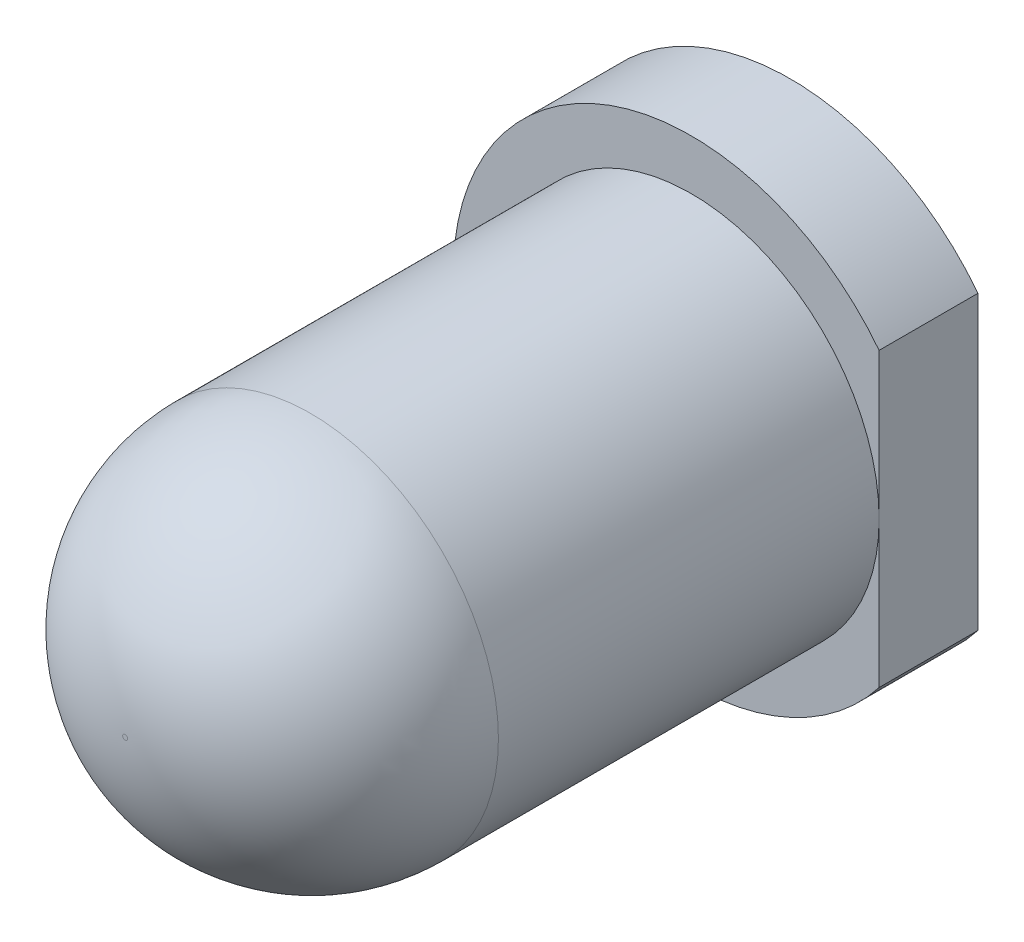
ISO-10303-21;
HEADER;
FILE_DESCRIPTION(('STEP AP214'),'2;1');
FILE_NAME('part.step','',(''),(''),'','','');
FILE_SCHEMA(('AUTOMOTIVE_DESIGN { 1 0 10303 214 1 1 1 1 }'));
ENDSEC;
DATA;
#1=APPLICATION_CONTEXT('core data for automotive mechanical design processes');
#2=APPLICATION_PROTOCOL_DEFINITION('international standard','automotive_design',2000,#1);
#3=PRODUCT_CONTEXT('',#1,'mechanical');
#4=PRODUCT('Part','Part','',(#3));
#5=PRODUCT_RELATED_PRODUCT_CATEGORY('part','',(#4));
#6=PRODUCT_DEFINITION_FORMATION('','',#4);
#7=PRODUCT_DEFINITION_CONTEXT('part definition',#1,'design');
#8=PRODUCT_DEFINITION('design','',#6,#7);
#9=PRODUCT_DEFINITION_SHAPE('','',#8);
#10=(LENGTH_UNIT() NAMED_UNIT(*) SI_UNIT(.MILLI.,.METRE.));
#11=(NAMED_UNIT(*) PLANE_ANGLE_UNIT() SI_UNIT($,.RADIAN.));
#12=(NAMED_UNIT(*) SI_UNIT($,.STERADIAN.) SOLID_ANGLE_UNIT());
#13=UNCERTAINTY_MEASURE_WITH_UNIT(LENGTH_MEASURE(1.E-05),#10,'distance_accuracy_value','');
#14=(GEOMETRIC_REPRESENTATION_CONTEXT(3) GLOBAL_UNCERTAINTY_ASSIGNED_CONTEXT((#13)) GLOBAL_UNIT_ASSIGNED_CONTEXT((#10,
#11,#12)) REPRESENTATION_CONTEXT('',''));
#15=CARTESIAN_POINT('',(0.,0.,0.));
#16=DIRECTION('',(0.,0.,1.));
#17=DIRECTION('',(1.,0.,0.));
#18=AXIS2_PLACEMENT_3D('',#15,#16,#17);
#19=CARTESIAN_POINT('',(0.,0.,5.38));
#20=DIRECTION('',(0.,0.,1.));
#21=DIRECTION('',(1.,0.,0.));
#22=AXIS2_PLACEMENT_3D('',#19,#20,#21);
#23=PLANE('',#22);
#24=CARTESIAN_POINT('',(0.,0.,5.38));
#25=DIRECTION('',(0.,0.,1.));
#26=DIRECTION('',(1.,0.,0.));
#27=AXIS2_PLACEMENT_3D('',#24,#25,#26);
#28=CIRCLE('',#27,0.02);
#29=CARTESIAN_POINT('',(0.02,0.,5.38));
#30=VERTEX_POINT('',#29);
#31=EDGE_CURVE('E11',#30,#30,#28,.T.);
#32=ORIENTED_EDGE('',*,*,#31,.T.);
#33=EDGE_LOOP('',(#32));
#34=FACE_BOUND('',#33,.T.);
#35=ADVANCED_FACE('F16',(#34),#23,.T.);
#36=CARTESIAN_POINT('',(1.52,0.,3.88));
#37=CARTESIAN_POINT('',(1.52,0.,4.115619449019));
#38=CARTESIAN_POINT('',(1.473746610581,0.,4.351242630973));
#39=CARTESIAN_POINT('',(1.381172946414,0.,4.574735226524));
#40=CARTESIAN_POINT('',(1.247268281961,0.,4.774052061599));
#41=CARTESIAN_POINT('',(0.914052061599,0.,5.107268281961));
#42=CARTESIAN_POINT('',(0.714735226524,0.,5.241172946414));
#43=CARTESIAN_POINT('',(0.491242630973,0.,5.333746610581));
#44=CARTESIAN_POINT('',(0.255619449019,0.,5.38));
#45=CARTESIAN_POINT('',(0.02,0.,5.38));
#46=(BOUNDED_CURVE() B_SPLINE_CURVE(5,(#36,#37,#38,#39,#40,#41,#42,#43,#44,#45),.UNSPECIFIED.,
.F.,.F.) B_SPLINE_CURVE_WITH_KNOTS((6,4,6),(0.,0.785398163397,1.570796326795),
.UNSPECIFIED.) CURVE() GEOMETRIC_REPRESENTATION_ITEM() RATIONAL_B_SPLINE_CURVE((1.,1.,1.,1.,1.,
1.,1.,1.,1.,1.)) REPRESENTATION_ITEM(''));
#47=CARTESIAN_POINT('',(0.,0.,3.88));
#48=DIRECTION('',(0.,0.,-1.));
#49=AXIS1_PLACEMENT('',#47,#48);
#50=SURFACE_OF_REVOLUTION('',#46,#49);
#51=CARTESIAN_POINT('',(0.02,0.,3.88));
#52=DIRECTION('',(0.,-1.,0.));
#53=DIRECTION('',(1.,0.,0.));
#54=AXIS2_PLACEMENT_3D('',#51,#52,#53);
#55=CIRCLE('',#54,1.5);
#56=CARTESIAN_POINT('',(1.52,0.,3.88));
#57=VERTEX_POINT('',#56);
#58=EDGE_CURVE('E27',#57,#30,#55,.T.);
#59=ORIENTED_EDGE('',*,*,#58,.F.);
#60=CARTESIAN_POINT('',(0.,0.,3.88));
#61=DIRECTION('',(0.,0.,1.));
#62=DIRECTION('',(1.,0.,0.));
#63=AXIS2_PLACEMENT_3D('',#60,#61,#62);
#64=CIRCLE('',#63,1.52);
#65=EDGE_CURVE('E265',#57,#57,#64,.T.);
#66=ORIENTED_EDGE('',*,*,#65,.T.);
#67=ORIENTED_EDGE('',*,*,#58,.T.);
#68=ORIENTED_EDGE('',*,*,#31,.F.);
#69=EDGE_LOOP('',(#59,#66,#67,#68));
#70=FACE_BOUND('',#69,.T.);
#71=ADVANCED_FACE('F526',(#70),#50,.F.);
#72=CARTESIAN_POINT('',(0.04710743554143,0.,0.));
#73=DIRECTION('',(0.,0.,-1.));
#74=DIRECTION('',(0.,-1.,0.));
#75=AXIS2_PLACEMENT_3D('',#72,#73,#74);
#76=PLANE('',#75);
#77=DIRECTION('',(1.,0.,0.));
#78=VECTOR('',#77,1.);
#79=CARTESIAN_POINT('',(-1.52,-0.25,0.));
#80=LINE('',#79,#78);
#81=CARTESIAN_POINT('',(-1.52,-0.25,0.));
#82=VERTEX_POINT('',#81);
#83=CARTESIAN_POINT('',(-1.02,-0.25,0.));
#84=VERTEX_POINT('',#83);
#85=EDGE_CURVE('E150',#82,#84,#80,.T.);
#86=ORIENTED_EDGE('',*,*,#85,.F.);
#87=DIRECTION('',(0.,-1.,0.));
#88=VECTOR('',#87,1.);
#89=CARTESIAN_POINT('',(-1.52,0.25,0.));
#90=LINE('',#89,#88);
#91=CARTESIAN_POINT('',(-1.52,0.25,0.));
#92=VERTEX_POINT('',#91);
#93=EDGE_CURVE('E20',#92,#82,#90,.T.);
#94=ORIENTED_EDGE('',*,*,#93,.F.);
#95=DIRECTION('',(-1.,0.,0.));
#96=VECTOR('',#95,1.);
#97=CARTESIAN_POINT('',(-1.02,0.25,0.));
#98=LINE('',#97,#96);
#99=CARTESIAN_POINT('',(-1.02,0.25,0.));
#100=VERTEX_POINT('',#99);
#101=EDGE_CURVE('E209',#100,#92,#98,.T.);
#102=ORIENTED_EDGE('',*,*,#101,.F.);
#103=DIRECTION('',(0.,1.,0.));
#104=VECTOR('',#103,1.);
#105=CARTESIAN_POINT('',(-1.02,-0.25,0.));
#106=LINE('',#105,#104);
#107=EDGE_CURVE('E215',#84,#100,#106,.T.);
#108=ORIENTED_EDGE('',*,*,#107,.F.);
#109=EDGE_LOOP('',(#86,#94,#102,#108));
#110=FACE_BOUND('',#109,.T.);
#111=ADVANCED_FACE('F463',(#110),#76,.T.);
#112=CARTESIAN_POINT('',(0.,0.,0.8));
#113=DIRECTION('',(0.,0.,-1.));
#114=DIRECTION('',(1.,0.,0.));
#115=AXIS2_PLACEMENT_3D('',#112,#113,#114);
#116=CYLINDRICAL_SURFACE('',#115,1.52);
#117=CARTESIAN_POINT('',(0.,0.,0.8));
#118=DIRECTION('',(0.,0.,1.));
#119=DIRECTION('',(1.,0.,0.));
#120=AXIS2_PLACEMENT_3D('',#117,#118,#119);
#121=CIRCLE('',#120,1.52);
#122=CARTESIAN_POINT('',(1.52,0.,0.8));
#123=VERTEX_POINT('',#122);
#124=EDGE_CURVE('E206',#123,#123,#121,.T.);
#125=ORIENTED_EDGE('',*,*,#124,.T.);
#126=DIRECTION('',(0.,0.,1.));
#127=VECTOR('',#126,1.);
#128=CARTESIAN_POINT('',(1.52,0.,0.8));
#129=LINE('',#128,#127);
#130=EDGE_CURVE('E55',#123,#57,#129,.T.);
#131=ORIENTED_EDGE('',*,*,#130,.T.);
#132=ORIENTED_EDGE('',*,*,#65,.F.);
#133=ORIENTED_EDGE('',*,*,#130,.F.);
#134=EDGE_LOOP('',(#125,#131,#132,#133));
#135=FACE_BOUND('',#134,.T.);
#136=ADVANCED_FACE('F524',(#135),#116,.T.);
#137=CARTESIAN_POINT('',(-1.52,-0.25,0.));
#138=DIRECTION('',(0.,1.,0.));
#139=DIRECTION('',(1.,0.,0.));
#140=AXIS2_PLACEMENT_3D('',#137,#138,#139);
#141=PLANE('',#140);
#142=ORIENTED_EDGE('',*,*,#85,.T.);
#143=DIRECTION('',(0.,0.,1.));
#144=VECTOR('',#143,1.);
#145=CARTESIAN_POINT('',(-1.02,-0.25,0.));
#146=LINE('',#145,#144);
#147=CARTESIAN_POINT('',(-1.02,-0.25,0.001));
#148=VERTEX_POINT('',#147);
#149=EDGE_CURVE('E300',#84,#148,#146,.T.);
#150=ORIENTED_EDGE('',*,*,#149,.T.);
#151=DIRECTION('',(1.,0.,0.));
#152=VECTOR('',#151,1.);
#153=CARTESIAN_POINT('',(-1.52,-0.25,0.001));
#154=LINE('',#153,#152);
#155=CARTESIAN_POINT('',(-1.52,-0.25,0.001));
#156=VERTEX_POINT('',#155);
#157=EDGE_CURVE('E210',#156,#148,#154,.T.);
#158=ORIENTED_EDGE('',*,*,#157,.F.);
#159=DIRECTION('',(0.,0.,1.));
#160=VECTOR('',#159,1.);
#161=CARTESIAN_POINT('',(-1.52,-0.25,0.));
#162=LINE('',#161,#160);
#163=EDGE_CURVE('E232',#82,#156,#162,.T.);
#164=ORIENTED_EDGE('',*,*,#163,.F.);
#165=EDGE_LOOP('',(#142,#150,#158,#164));
#166=FACE_BOUND('',#165,.T.);
#167=ADVANCED_FACE('F549',(#166),#141,.F.);
#168=CARTESIAN_POINT('',(-1.52,0.25,0.));
#169=DIRECTION('',(1.,0.,0.));
#170=DIRECTION('',(0.,1.,0.));
#171=AXIS2_PLACEMENT_3D('',#168,#169,#170);
#172=PLANE('',#171);
#173=ORIENTED_EDGE('',*,*,#93,.T.);
#174=ORIENTED_EDGE('',*,*,#163,.T.);
#175=DIRECTION('',(0.,-1.,0.));
#176=VECTOR('',#175,1.);
#177=CARTESIAN_POINT('',(-1.52,0.25,0.001));
#178=LINE('',#177,#176);
#179=CARTESIAN_POINT('',(-1.52,0.25,0.001));
#180=VERTEX_POINT('',#179);
#181=EDGE_CURVE('E291',#180,#156,#178,.T.);
#182=ORIENTED_EDGE('',*,*,#181,.F.);
#183=DIRECTION('',(0.,0.,1.));
#184=VECTOR('',#183,1.);
#185=CARTESIAN_POINT('',(-1.52,0.25,0.));
#186=LINE('',#185,#184);
#187=EDGE_CURVE('E216',#92,#180,#186,.T.);
#188=ORIENTED_EDGE('',*,*,#187,.F.);
#189=EDGE_LOOP('',(#173,#174,#182,#188));
#190=FACE_BOUND('',#189,.T.);
#191=ADVANCED_FACE('F470',(#190),#172,.F.);
#192=CARTESIAN_POINT('',(-1.02,-0.25,0.));
#193=DIRECTION('',(-1.,0.,0.));
#194=DIRECTION('',(0.,0.,1.));
#195=AXIS2_PLACEMENT_3D('',#192,#193,#194);
#196=PLANE('',#195);
#197=ORIENTED_EDGE('',*,*,#107,.T.);
#198=DIRECTION('',(0.,0.,1.));
#199=VECTOR('',#198,1.);
#200=CARTESIAN_POINT('',(-1.02,0.25,0.));
#201=LINE('',#200,#199);
#202=CARTESIAN_POINT('',(-1.02,0.25,0.001));
#203=VERTEX_POINT('',#202);
#204=EDGE_CURVE('E211',#100,#203,#201,.T.);
#205=ORIENTED_EDGE('',*,*,#204,.T.);
#206=DIRECTION('',(0.,1.,0.));
#207=VECTOR('',#206,1.);
#208=CARTESIAN_POINT('',(-1.02,-0.25,0.001));
#209=LINE('',#208,#207);
#210=EDGE_CURVE('E183',#148,#203,#209,.T.);
#211=ORIENTED_EDGE('',*,*,#210,.F.);
#212=ORIENTED_EDGE('',*,*,#149,.F.);
#213=EDGE_LOOP('',(#197,#205,#211,#212));
#214=FACE_BOUND('',#213,.T.);
#215=ADVANCED_FACE('F455',(#214),#196,.F.);
#216=CARTESIAN_POINT('',(-1.02,0.25,0.));
#217=DIRECTION('',(0.,-1.,0.));
#218=DIRECTION('',(0.,0.,-1.));
#219=AXIS2_PLACEMENT_3D('',#216,#217,#218);
#220=PLANE('',#219);
#221=ORIENTED_EDGE('',*,*,#101,.T.);
#222=ORIENTED_EDGE('',*,*,#187,.T.);
#223=DIRECTION('',(-1.,0.,0.));
#224=VECTOR('',#223,1.);
#225=CARTESIAN_POINT('',(-1.02,0.25,0.001));
#226=LINE('',#225,#224);
#227=EDGE_CURVE('E189',#203,#180,#226,.T.);
#228=ORIENTED_EDGE('',*,*,#227,.F.);
#229=ORIENTED_EDGE('',*,*,#204,.F.);
#230=EDGE_LOOP('',(#221,#222,#228,#229));
#231=FACE_BOUND('',#230,.T.);
#232=ADVANCED_FACE('F462',(#231),#220,.F.);
#233=CARTESIAN_POINT('',(0.04710743554143,0.,0.8));
#234=DIRECTION('',(0.,0.,-1.));
#235=DIRECTION('',(0.,-1.,0.));
#236=AXIS2_PLACEMENT_3D('',#233,#234,#235);
#237=PLANE('',#236);
#238=DIRECTION('',(0.,-1.,0.));
#239=VECTOR('',#238,1.);
#240=CARTESIAN_POINT('',(1.52,1.181196427357,0.8));
#241=LINE('',#240,#239);
#242=CARTESIAN_POINT('',(1.52,-1.181196427357,0.8));
#243=VERTEX_POINT('',#242);
#244=EDGE_CURVE('E261',#123,#243,#241,.T.);
#245=ORIENTED_EDGE('',*,*,#244,.F.);
#246=ORIENTED_EDGE('',*,*,#124,.F.);
#247=DIRECTION('',(0.,-1.,0.));
#248=VECTOR('',#247,1.);
#249=CARTESIAN_POINT('',(1.52,1.181196427357,0.8));
#250=LINE('',#249,#248);
#251=CARTESIAN_POINT('',(1.52,1.181196427357,0.8));
#252=VERTEX_POINT('',#251);
#253=EDGE_CURVE('E299',#252,#123,#250,.T.);
#254=ORIENTED_EDGE('',*,*,#253,.F.);
#255=CARTESIAN_POINT('',(0.,0.,0.8));
#256=DIRECTION('',(0.,0.,1.));
#257=DIRECTION('',(1.,0.,0.));
#258=AXIS2_PLACEMENT_3D('',#255,#256,#257);
#259=CIRCLE('',#258,1.925);
#260=EDGE_CURVE('E70',#252,#243,#259,.T.);
#261=ORIENTED_EDGE('',*,*,#260,.T.);
#262=EDGE_LOOP('',(#245,#246,#254,#261));
#263=FACE_BOUND('',#262,.T.);
#264=ADVANCED_FACE('F523',(#263),#237,.F.);
#265=CARTESIAN_POINT('',(-1.52,-0.349,0.001));
#266=DIRECTION('',(1.,0.,0.));
#267=DIRECTION('',(0.,0.,1.));
#268=AXIS2_PLACEMENT_3D('',#265,#266,#267);
#269=CYLINDRICAL_SURFACE('',#268,0.099);
#270=CARTESIAN_POINT('',(-1.619,-0.349,0.001));
#271=DIRECTION('',(-0.707106781186548,0.707106781186548,0.));
#272=DIRECTION('',(0.707106781186548,0.707106781186548,0.));
#273=AXIS2_PLACEMENT_3D('',#270,#271,#272);
#274=ELLIPSE('',#273,0.140007142675,0.099);
#275=CARTESIAN_POINT('',(-1.619,-0.349,0.1));
#276=VERTEX_POINT('',#275);
#277=EDGE_CURVE('E257',#276,#156,#274,.T.);
#278=ORIENTED_EDGE('',*,*,#277,.T.);
#279=ORIENTED_EDGE('',*,*,#157,.T.);
#280=CARTESIAN_POINT('',(-0.921,-0.349,0.001));
#281=DIRECTION('',(-0.707106781186548,-0.707106781186548,0.));
#282=DIRECTION('',(-0.707106781186548,0.707106781186548,0.));
#283=AXIS2_PLACEMENT_3D('',#280,#281,#282);
#284=ELLIPSE('',#283,0.140007142675,0.099);
#285=CARTESIAN_POINT('',(-0.921,-0.349,0.1));
#286=VERTEX_POINT('',#285);
#287=EDGE_CURVE('E176',#286,#148,#284,.T.);
#288=ORIENTED_EDGE('',*,*,#287,.F.);
#289=DIRECTION('',(1.,0.,0.));
#290=VECTOR('',#289,1.);
#291=CARTESIAN_POINT('',(-1.52,-0.349,0.1));
#292=LINE('',#291,#290);
#293=EDGE_CURVE('E222',#276,#286,#292,.T.);
#294=ORIENTED_EDGE('',*,*,#293,.F.);
#295=EDGE_LOOP('',(#278,#279,#288,#294));
#296=FACE_BOUND('',#295,.T.);
#297=ADVANCED_FACE('F490',(#296),#269,.F.);
#298=CARTESIAN_POINT('',(-1.619,0.25,0.001));
#299=DIRECTION('',(0.,-1.,0.));
#300=DIRECTION('',(0.,0.,1.));
#301=AXIS2_PLACEMENT_3D('',#298,#299,#300);
#302=CYLINDRICAL_SURFACE('',#301,0.099);
#303=CARTESIAN_POINT('',(-1.619,0.349,0.001));
#304=DIRECTION('',(0.707106781186548,0.707106781186548,0.));
#305=DIRECTION('',(-0.707106781186548,0.707106781186548,0.));
#306=AXIS2_PLACEMENT_3D('',#303,#304,#305);
#307=ELLIPSE('',#306,0.140007142675,0.099);
#308=CARTESIAN_POINT('',(-1.619,0.349,0.1));
#309=VERTEX_POINT('',#308);
#310=EDGE_CURVE('E184',#309,#180,#307,.T.);
#311=ORIENTED_EDGE('',*,*,#310,.T.);
#312=ORIENTED_EDGE('',*,*,#181,.T.);
#313=ORIENTED_EDGE('',*,*,#277,.F.);
#314=DIRECTION('',(0.,-1.,0.));
#315=VECTOR('',#314,1.);
#316=CARTESIAN_POINT('',(-1.619,0.25,0.1));
#317=LINE('',#316,#315);
#318=EDGE_CURVE('E280',#309,#276,#317,.T.);
#319=ORIENTED_EDGE('',*,*,#318,.F.);
#320=EDGE_LOOP('',(#311,#312,#313,#319));
#321=FACE_BOUND('',#320,.T.);
#322=ADVANCED_FACE('F479',(#321),#302,.F.);
#323=CARTESIAN_POINT('',(-0.921,-0.25,0.001));
#324=DIRECTION('',(0.,1.,0.));
#325=DIRECTION('',(0.,0.,1.));
#326=AXIS2_PLACEMENT_3D('',#323,#324,#325);
#327=CYLINDRICAL_SURFACE('',#326,0.099);
#328=ORIENTED_EDGE('',*,*,#287,.T.);
#329=ORIENTED_EDGE('',*,*,#210,.T.);
#330=CARTESIAN_POINT('',(-0.921,0.349,0.001));
#331=DIRECTION('',(0.707106781186548,-0.707106781186548,0.));
#332=DIRECTION('',(-0.707106781186548,-0.707106781186548,0.));
#333=AXIS2_PLACEMENT_3D('',#330,#331,#332);
#334=ELLIPSE('',#333,0.140007142675,0.099);
#335=CARTESIAN_POINT('',(-0.921,0.349,0.1));
#336=VERTEX_POINT('',#335);
#337=EDGE_CURVE('E185',#336,#203,#334,.T.);
#338=ORIENTED_EDGE('',*,*,#337,.F.);
#339=DIRECTION('',(0.,1.,0.));
#340=VECTOR('',#339,1.);
#341=CARTESIAN_POINT('',(-0.921,-0.25,0.1));
#342=LINE('',#341,#340);
#343=EDGE_CURVE('E217',#286,#336,#342,.T.);
#344=ORIENTED_EDGE('',*,*,#343,.F.);
#345=EDGE_LOOP('',(#328,#329,#338,#344));
#346=FACE_BOUND('',#345,.T.);
#347=ADVANCED_FACE('F486',(#346),#327,.F.);
#348=CARTESIAN_POINT('',(-1.02,0.349,0.001));
#349=DIRECTION('',(-1.,0.,0.));
#350=DIRECTION('',(0.,0.,1.));
#351=AXIS2_PLACEMENT_3D('',#348,#349,#350);
#352=CYLINDRICAL_SURFACE('',#351,0.099);
#353=ORIENTED_EDGE('',*,*,#337,.T.);
#354=ORIENTED_EDGE('',*,*,#227,.T.);
#355=ORIENTED_EDGE('',*,*,#310,.F.);
#356=DIRECTION('',(-1.,0.,0.));
#357=VECTOR('',#356,1.);
#358=CARTESIAN_POINT('',(-1.02,0.349,0.1));
#359=LINE('',#358,#357);
#360=EDGE_CURVE('E276',#336,#309,#359,.T.);
#361=ORIENTED_EDGE('',*,*,#360,.F.);
#362=EDGE_LOOP('',(#353,#354,#355,#361));
#363=FACE_BOUND('',#362,.T.);
#364=ADVANCED_FACE('F483',(#363),#352,.F.);
#365=CARTESIAN_POINT('',(0.921,-0.25,0.001));
#366=DIRECTION('',(0.,1.,0.));
#367=DIRECTION('',(1.,0.,0.));
#368=AXIS2_PLACEMENT_3D('',#365,#366,#367);
#369=CYLINDRICAL_SURFACE('',#368,0.099);
#370=CARTESIAN_POINT('',(0.921,-0.349,0.001));
#371=DIRECTION('',(0.707106781186548,-0.707106781186548,0.));
#372=DIRECTION('',(0.707106781186548,0.707106781186548,0.));
#373=AXIS2_PLACEMENT_3D('',#370,#371,#372);
#374=ELLIPSE('',#373,0.140007142675,0.099);
#375=CARTESIAN_POINT('',(1.02,-0.25,0.001));
#376=VERTEX_POINT('',#375);
#377=CARTESIAN_POINT('',(0.921,-0.349,0.1));
#378=VERTEX_POINT('',#377);
#379=EDGE_CURVE('E191',#376,#378,#374,.T.);
#380=ORIENTED_EDGE('',*,*,#379,.T.);
#381=DIRECTION('',(0.,1.,0.));
#382=VECTOR('',#381,1.);
#383=CARTESIAN_POINT('',(0.921,-0.25,0.1));
#384=LINE('',#383,#382);
#385=CARTESIAN_POINT('',(0.921,0.349,0.1));
#386=VERTEX_POINT('',#385);
#387=EDGE_CURVE('E227',#378,#386,#384,.T.);
#388=ORIENTED_EDGE('',*,*,#387,.T.);
#389=CARTESIAN_POINT('',(0.921,0.349,0.001));
#390=DIRECTION('',(-0.707106781186548,-0.707106781186548,0.));
#391=DIRECTION('',(-0.707106781186548,0.707106781186548,0.));
#392=AXIS2_PLACEMENT_3D('',#389,#390,#391);
#393=ELLIPSE('',#392,0.140007142675,0.099);
#394=CARTESIAN_POINT('',(1.02,0.25,0.001));
#395=VERTEX_POINT('',#394);
#396=EDGE_CURVE('E190',#395,#386,#393,.T.);
#397=ORIENTED_EDGE('',*,*,#396,.F.);
#398=DIRECTION('',(0.,1.,0.));
#399=VECTOR('',#398,1.);
#400=CARTESIAN_POINT('',(1.02,-0.25,0.001));
#401=LINE('',#400,#399);
#402=EDGE_CURVE('E195',#376,#395,#401,.T.);
#403=ORIENTED_EDGE('',*,*,#402,.F.);
#404=EDGE_LOOP('',(#380,#388,#397,#403));
#405=FACE_BOUND('',#404,.T.);
#406=ADVANCED_FACE('F401',(#405),#369,.F.);
#407=CARTESIAN_POINT('',(1.02,0.349,0.001));
#408=DIRECTION('',(1.,0.,0.));
#409=DIRECTION('',(0.,-1.,0.));
#410=AXIS2_PLACEMENT_3D('',#407,#408,#409);
#411=CYLINDRICAL_SURFACE('',#410,0.099);
#412=ORIENTED_EDGE('',*,*,#396,.T.);
#413=DIRECTION('',(1.,0.,0.));
#414=VECTOR('',#413,1.);
#415=CARTESIAN_POINT('',(1.02,0.349,0.1));
#416=LINE('',#415,#414);
#417=CARTESIAN_POINT('',(1.321,0.349,0.1));
#418=VERTEX_POINT('',#417);
#419=EDGE_CURVE('E223',#386,#418,#416,.T.);
#420=ORIENTED_EDGE('',*,*,#419,.T.);
#421=CARTESIAN_POINT('',(1.321,0.349,0.001));
#422=DIRECTION('',(-0.707106781186548,-0.707106781186548,0.));
#423=DIRECTION('',(-0.707106781186548,0.707106781186548,0.));
#424=AXIS2_PLACEMENT_3D('',#421,#422,#423);
#425=ELLIPSE('',#424,0.140007142675,0.099);
#426=CARTESIAN_POINT('',(1.42,0.25,0.001));
#427=VERTEX_POINT('',#426);
#428=EDGE_CURVE('E221',#427,#418,#425,.T.);
#429=ORIENTED_EDGE('',*,*,#428,.F.);
#430=DIRECTION('',(1.,0.,0.));
#431=VECTOR('',#430,1.);
#432=CARTESIAN_POINT('',(1.02,0.25,0.001));
#433=LINE('',#432,#431);
#434=EDGE_CURVE('E170',#395,#427,#433,.T.);
#435=ORIENTED_EDGE('',*,*,#434,.F.);
#436=EDGE_LOOP('',(#412,#420,#429,#435));
#437=FACE_BOUND('',#436,.T.);
#438=ADVANCED_FACE('F412',(#437),#411,.F.);
#439=CARTESIAN_POINT('',(1.42,-0.349,0.001));
#440=DIRECTION('',(-1.,0.,0.));
#441=DIRECTION('',(0.,1.,0.));
#442=AXIS2_PLACEMENT_3D('',#439,#440,#441);
#443=CYLINDRICAL_SURFACE('',#442,0.099);
#444=CARTESIAN_POINT('',(1.321,-0.349,0.001));
#445=DIRECTION('',(0.707106781186548,-0.707106781186548,0.));
#446=DIRECTION('',(0.707106781186548,0.707106781186548,0.));
#447=AXIS2_PLACEMENT_3D('',#444,#445,#446);
#448=ELLIPSE('',#447,0.140007142675,0.099);
#449=CARTESIAN_POINT('',(1.42,-0.25,0.001));
#450=VERTEX_POINT('',#449);
#451=CARTESIAN_POINT('',(1.321,-0.349,0.1));
#452=VERTEX_POINT('',#451);
#453=EDGE_CURVE('E201',#450,#452,#448,.T.);
#454=ORIENTED_EDGE('',*,*,#453,.T.);
#455=DIRECTION('',(-1.,0.,0.));
#456=VECTOR('',#455,1.);
#457=CARTESIAN_POINT('',(1.42,-0.349,0.1));
#458=LINE('',#457,#456);
#459=EDGE_CURVE('E238',#452,#378,#458,.T.);
#460=ORIENTED_EDGE('',*,*,#459,.T.);
#461=ORIENTED_EDGE('',*,*,#379,.F.);
#462=DIRECTION('',(-1.,0.,0.));
#463=VECTOR('',#462,1.);
#464=CARTESIAN_POINT('',(1.42,-0.25,0.001));
#465=LINE('',#464,#463);
#466=EDGE_CURVE('E196',#450,#376,#465,.T.);
#467=ORIENTED_EDGE('',*,*,#466,.F.);
#468=EDGE_LOOP('',(#454,#460,#461,#467));
#469=FACE_BOUND('',#468,.T.);
#470=ADVANCED_FACE('F405',(#469),#443,.F.);
#471=CARTESIAN_POINT('',(1.02,-0.25,0.));
#472=DIRECTION('',(-1.,0.,0.));
#473=DIRECTION('',(0.,0.,1.));
#474=AXIS2_PLACEMENT_3D('',#471,#472,#473);
#475=PLANE('',#474);
#476=DIRECTION('',(0.,0.,1.));
#477=VECTOR('',#476,1.);
#478=CARTESIAN_POINT('',(1.02,-0.25,0.));
#479=LINE('',#478,#477);
#480=CARTESIAN_POINT('',(1.02,-0.25,0.));
#481=VERTEX_POINT('',#480);
#482=EDGE_CURVE('E200',#481,#376,#479,.T.);
#483=ORIENTED_EDGE('',*,*,#482,.T.);
#484=ORIENTED_EDGE('',*,*,#402,.T.);
#485=DIRECTION('',(0.,0.,1.));
#486=VECTOR('',#485,1.);
#487=CARTESIAN_POINT('',(1.02,0.25,0.));
#488=LINE('',#487,#486);
#489=CARTESIAN_POINT('',(1.02,0.25,0.));
#490=VERTEX_POINT('',#489);
#491=EDGE_CURVE('E163',#490,#395,#488,.T.);
#492=ORIENTED_EDGE('',*,*,#491,.F.);
#493=DIRECTION('',(0.,1.,0.));
#494=VECTOR('',#493,1.);
#495=CARTESIAN_POINT('',(1.02,-0.25,0.));
#496=LINE('',#495,#494);
#497=EDGE_CURVE('E205',#481,#490,#496,.T.);
#498=ORIENTED_EDGE('',*,*,#497,.F.);
#499=EDGE_LOOP('',(#483,#484,#492,#498));
#500=FACE_BOUND('',#499,.T.);
#501=ADVANCED_FACE('F416',(#500),#475,.T.);
#502=CARTESIAN_POINT('',(1.02,0.25,0.));
#503=DIRECTION('',(0.,1.,0.));
#504=DIRECTION('',(1.,0.,0.));
#505=AXIS2_PLACEMENT_3D('',#502,#503,#504);
#506=PLANE('',#505);
#507=ORIENTED_EDGE('',*,*,#491,.T.);
#508=ORIENTED_EDGE('',*,*,#434,.T.);
#509=DIRECTION('',(0.,0.,1.));
#510=VECTOR('',#509,1.);
#511=CARTESIAN_POINT('',(1.42,0.25,0.));
#512=LINE('',#511,#510);
#513=CARTESIAN_POINT('',(1.42,0.25,0.));
#514=VERTEX_POINT('',#513);
#515=EDGE_CURVE('E239',#514,#427,#512,.T.);
#516=ORIENTED_EDGE('',*,*,#515,.F.);
#517=DIRECTION('',(1.,0.,0.));
#518=VECTOR('',#517,1.);
#519=CARTESIAN_POINT('',(1.02,0.25,0.));
#520=LINE('',#519,#518);
#521=EDGE_CURVE('E202',#490,#514,#520,.T.);
#522=ORIENTED_EDGE('',*,*,#521,.F.);
#523=EDGE_LOOP('',(#507,#508,#516,#522));
#524=FACE_BOUND('',#523,.T.);
#525=ADVANCED_FACE('F544',(#524),#506,.T.);
#526=CARTESIAN_POINT('',(0.,0.,0.));
#527=DIRECTION('',(0.,0.,-1.));
#528=DIRECTION('',(1.,0.,0.));
#529=AXIS2_PLACEMENT_3D('',#526,#527,#528);
#530=CYLINDRICAL_SURFACE('',#529,1.925);
#531=CARTESIAN_POINT('',(0.,0.,0.));
#532=DIRECTION('',(0.,0.,1.));
#533=DIRECTION('',(1.,0.,0.));
#534=AXIS2_PLACEMENT_3D('',#531,#532,#533);
#535=CIRCLE('',#534,1.925);
#536=CARTESIAN_POINT('',(1.52,1.181196427357,0.));
#537=VERTEX_POINT('',#536);
#538=CARTESIAN_POINT('',(1.52,-1.181196427357,0.));
#539=VERTEX_POINT('',#538);
#540=EDGE_CURVE('E439',#537,#539,#535,.T.);
#541=ORIENTED_EDGE('',*,*,#540,.T.);
#542=DIRECTION('',(0.,0.,1.));
#543=VECTOR('',#542,1.);
#544=CARTESIAN_POINT('',(1.52,-1.181196427357,0.));
#545=LINE('',#544,#543);
#546=EDGE_CURVE('E258',#539,#243,#545,.T.);
#547=ORIENTED_EDGE('',*,*,#546,.T.);
#548=ORIENTED_EDGE('',*,*,#260,.F.);
#549=DIRECTION('',(0.,0.,1.));
#550=VECTOR('',#549,1.);
#551=CARTESIAN_POINT('',(1.52,1.181196427357,0.));
#552=LINE('',#551,#550);
#553=EDGE_CURVE('E295',#537,#252,#552,.T.);
#554=ORIENTED_EDGE('',*,*,#553,.F.);
#555=EDGE_LOOP('',(#541,#547,#548,#554));
#556=FACE_BOUND('',#555,.T.);
#557=ADVANCED_FACE('F18',(#556),#530,.T.);
#558=CARTESIAN_POINT('',(1.52,1.181196427357,0.));
#559=DIRECTION('',(1.,0.,0.));
#560=DIRECTION('',(0.,1.,0.));
#561=AXIS2_PLACEMENT_3D('',#558,#559,#560);
#562=PLANE('',#561);
#563=ORIENTED_EDGE('',*,*,#553,.T.);
#564=ORIENTED_EDGE('',*,*,#253,.T.);
#565=ORIENTED_EDGE('',*,*,#244,.T.);
#566=ORIENTED_EDGE('',*,*,#546,.F.);
#567=DIRECTION('',(0.,-1.,0.));
#568=VECTOR('',#567,1.);
#569=CARTESIAN_POINT('',(1.52,1.181196427357,0.));
#570=LINE('',#569,#568);
#571=EDGE_CURVE('E156',#537,#539,#570,.T.);
#572=ORIENTED_EDGE('',*,*,#571,.F.);
#573=EDGE_LOOP('',(#563,#564,#565,#566,#572));
#574=FACE_BOUND('',#573,.T.);
#575=ADVANCED_FACE('F518',(#574),#562,.T.);
#576=CARTESIAN_POINT('',(1.321,0.25,0.001));
#577=DIRECTION('',(0.,1.,0.));
#578=DIRECTION('',(1.,0.,0.));
#579=AXIS2_PLACEMENT_3D('',#576,#577,#578);
#580=CYLINDRICAL_SURFACE('',#579,0.099);
#581=ORIENTED_EDGE('',*,*,#428,.T.);
#582=DIRECTION('',(0.,1.,0.));
#583=VECTOR('',#582,1.);
#584=CARTESIAN_POINT('',(1.321,0.25,0.1));
#585=LINE('',#584,#583);
#586=CARTESIAN_POINT('',(1.321,1.110871279672,0.1));
#587=VERTEX_POINT('',#586);
#588=EDGE_CURVE('E228',#418,#587,#585,.T.);
#589=ORIENTED_EDGE('',*,*,#588,.T.);
#590=CARTESIAN_POINT('',(1.42,1.146396528257,0.001));
#591=CARTESIAN_POINT('',(1.419999998987,1.146396526287,0.02125876072404));
#592=CARTESIAN_POINT('',(1.415163403371,1.14468787317,0.04151873587734));
#593=CARTESIAN_POINT('',(1.405489350111,1.141270101434,0.06039024741974));
#594=CARTESIAN_POINT('',(1.391478382053,1.136304591358,0.07648439233626));
#595=CARTESIAN_POINT('',(1.374130100074,1.130110658325,0.08866255670713));
#596=CARTESIAN_POINT('',(1.354746788412,1.123130825513,0.09624687926518));
#597=CARTESIAN_POINT('',(1.332753388435,1.115148305203,0.09931943723926));
#598=CARTESIAN_POINT('',(1.330802867535,1.114439841167,0.09954607495158));
#599=CARTESIAN_POINT('',(1.32884732283,1.11372902605,0.09972755842079));
#600=CARTESIAN_POINT('',(1.326888006457,1.113016309057,0.09986375763367));
#601=CARTESIAN_POINT('',(1.324926174052,1.112302142017,0.09995458593684));
#602=CARTESIAN_POINT('',(1.322963084756,1.111586979382,0.100000000037));
#603=CARTESIAN_POINT('',(1.321000001212,1.110871278231,0.1));
#604=(BOUNDED_CURVE() B_SPLINE_CURVE(7,(#590,#591,#592,#593,#594,#595,#596,#597,#598,#599,#600,
#601,#602,#603),.UNSPECIFIED.,.F.,.F.) B_SPLINE_CURVE_WITH_KNOTS((8,6,8),(0.,0.911598549296,1.),
.UNSPECIFIED.) CURVE() GEOMETRIC_REPRESENTATION_ITEM() RATIONAL_B_SPLINE_CURVE((1.,1.,1.,1.,1.,
1.,1.,1.,1.,1.,1.,1.,1.,1.)) REPRESENTATION_ITEM(''));
#605=CARTESIAN_POINT('',(1.42,1.146396528257,0.001));
#606=VERTEX_POINT('',#605);
#607=EDGE_CURVE('E157',#606,#587,#604,.T.);
#608=ORIENTED_EDGE('',*,*,#607,.F.);
#609=DIRECTION('',(0.,1.,0.));
#610=VECTOR('',#609,1.);
#611=CARTESIAN_POINT('',(1.42,0.25,0.001));
#612=LINE('',#611,#610);
#613=EDGE_CURVE('E243',#427,#606,#612,.T.);
#614=ORIENTED_EDGE('',*,*,#613,.F.);
#615=EDGE_LOOP('',(#581,#589,#608,#614));
#616=FACE_BOUND('',#615,.T.);
#617=ADVANCED_FACE('F316',(#616),#580,.F.);
#618=CARTESIAN_POINT('',(0.106221193918,0.,0.1));
#619=DIRECTION('',(0.,0.,-1.));
#620=DIRECTION('',(0.,-1.,0.));
#621=AXIS2_PLACEMENT_3D('',#618,#619,#620);
#622=PLANE('',#621);
#623=ORIENTED_EDGE('',*,*,#360,.T.);
#624=ORIENTED_EDGE('',*,*,#318,.T.);
#625=ORIENTED_EDGE('',*,*,#293,.T.);
#626=ORIENTED_EDGE('',*,*,#343,.T.);
#627=EDGE_LOOP('',(#623,#624,#625,#626));
#628=FACE_BOUND('',#627,.T.);
#629=CARTESIAN_POINT('',(0.,0.,0.1));
#630=DIRECTION('',(0.,0.,-1.));
#631=DIRECTION('',(0.778082191780786,-0.628162481236828,0.));
#632=AXIS2_PLACEMENT_3D('',#629,#630,#631);
#633=CIRCLE('',#632,1.726);
#634=CARTESIAN_POINT('',(1.321,-1.110871279672,0.1));
#635=VERTEX_POINT('',#634);
#636=EDGE_CURVE('E152',#635,#587,#633,.T.);
#637=ORIENTED_EDGE('',*,*,#636,.T.);
#638=ORIENTED_EDGE('',*,*,#588,.F.);
#639=ORIENTED_EDGE('',*,*,#419,.F.);
#640=ORIENTED_EDGE('',*,*,#387,.F.);
#641=ORIENTED_EDGE('',*,*,#459,.F.);
#642=DIRECTION('',(0.,1.,0.));
#643=VECTOR('',#642,1.);
#644=CARTESIAN_POINT('',(1.321,-1.146396528257,0.1));
#645=LINE('',#644,#643);
#646=EDGE_CURVE('E284',#635,#452,#645,.T.);
#647=ORIENTED_EDGE('',*,*,#646,.F.);
#648=EDGE_LOOP('',(#637,#638,#639,#640,#641,#647));
#649=FACE_BOUND('',#648,.T.);
#650=ADVANCED_FACE('F409',(#628,#649),#622,.T.);
#651=CARTESIAN_POINT('',(1.42,-0.25,0.));
#652=DIRECTION('',(0.,-1.,0.));
#653=DIRECTION('',(0.,0.,-1.));
#654=AXIS2_PLACEMENT_3D('',#651,#652,#653);
#655=PLANE('',#654);
#656=DIRECTION('',(0.,0.,1.));
#657=VECTOR('',#656,1.);
#658=CARTESIAN_POINT('',(1.42,-0.25,0.));
#659=LINE('',#658,#657);
#660=CARTESIAN_POINT('',(1.42,-0.25,0.));
#661=VERTEX_POINT('',#660);
#662=EDGE_CURVE('E117',#661,#450,#659,.T.);
#663=ORIENTED_EDGE('',*,*,#662,.T.);
#664=ORIENTED_EDGE('',*,*,#466,.T.);
#665=ORIENTED_EDGE('',*,*,#482,.F.);
#666=DIRECTION('',(-1.,0.,0.));
#667=VECTOR('',#666,1.);
#668=CARTESIAN_POINT('',(1.42,-0.25,0.));
#669=LINE('',#668,#667);
#670=EDGE_CURVE('E424',#661,#481,#669,.T.);
#671=ORIENTED_EDGE('',*,*,#670,.F.);
#672=EDGE_LOOP('',(#663,#664,#665,#671));
#673=FACE_BOUND('',#672,.T.);
#674=ADVANCED_FACE('F423',(#673),#655,.T.);
#675=CARTESIAN_POINT('',(1.321,-1.146396528257,0.001));
#676=DIRECTION('',(0.,1.,0.));
#677=DIRECTION('',(1.,0.,0.));
#678=AXIS2_PLACEMENT_3D('',#675,#676,#677);
#679=CYLINDRICAL_SURFACE('',#678,0.099);
#680=CARTESIAN_POINT('',(1.42,-1.146396528257,0.001));
#681=CARTESIAN_POINT('',(1.419999998889,-1.146396526096,0.02322318387792));
#682=CARTESIAN_POINT('',(1.414179941378,-1.144340442402,0.04544795657592));
#683=CARTESIAN_POINT('',(1.402538606567,-1.140227613385,0.06584018826717));
#684=CARTESIAN_POINT('',(1.385800418067,-1.134291663529,0.08256529242793));
#685=CARTESIAN_POINT('',(1.365414407119,-1.126995015846,0.09418858395967));
#686=CARTESIAN_POINT('',(1.343206372936,-1.118967243934,0.100000040068));
#687=CARTESIAN_POINT('',(1.320999999937,-1.110871279747,0.1));
#688=(BOUNDED_CURVE() B_SPLINE_CURVE(7,(#680,#681,#682,#683,#684,#685,#686,#687),.UNSPECIFIED.,
.F.,.F.) B_SPLINE_CURVE_WITH_KNOTS((8,8),(0.,1.),
.UNSPECIFIED.) CURVE() GEOMETRIC_REPRESENTATION_ITEM() RATIONAL_B_SPLINE_CURVE((1.,1.,1.,1.,1.,
1.,1.,1.)) REPRESENTATION_ITEM(''));
#689=CARTESIAN_POINT('',(1.42,-1.146396528257,0.001));
#690=VERTEX_POINT('',#689);
#691=EDGE_CURVE('E122',#690,#635,#688,.T.);
#692=ORIENTED_EDGE('',*,*,#691,.T.);
#693=ORIENTED_EDGE('',*,*,#646,.T.);
#694=ORIENTED_EDGE('',*,*,#453,.F.);
#695=DIRECTION('',(0.,1.,0.));
#696=VECTOR('',#695,1.);
#697=CARTESIAN_POINT('',(1.42,-1.146396528257,0.001));
#698=LINE('',#697,#696);
#699=EDGE_CURVE('E132',#690,#450,#698,.T.);
#700=ORIENTED_EDGE('',*,*,#699,.F.);
#701=EDGE_LOOP('',(#692,#693,#694,#700));
#702=FACE_BOUND('',#701,.T.);
#703=ADVANCED_FACE('F328',(#702),#679,.F.);
#704=CARTESIAN_POINT('',(1.42,0.25,0.));
#705=DIRECTION('',(-1.,0.,0.));
#706=DIRECTION('',(0.,0.,1.));
#707=AXIS2_PLACEMENT_3D('',#704,#705,#706);
#708=PLANE('',#707);
#709=ORIENTED_EDGE('',*,*,#515,.T.);
#710=ORIENTED_EDGE('',*,*,#613,.T.);
#711=DIRECTION('',(0.,0.,1.));
#712=VECTOR('',#711,1.);
#713=CARTESIAN_POINT('',(1.42,1.146396528257,0.));
#714=LINE('',#713,#712);
#715=CARTESIAN_POINT('',(1.42,1.146396528257,0.));
#716=VERTEX_POINT('',#715);
#717=EDGE_CURVE('E141',#716,#606,#714,.T.);
#718=ORIENTED_EDGE('',*,*,#717,.F.);
#719=DIRECTION('',(0.,1.,0.));
#720=VECTOR('',#719,1.);
#721=CARTESIAN_POINT('',(1.42,0.25,0.));
#722=LINE('',#721,#720);
#723=EDGE_CURVE('E138',#514,#716,#722,.T.);
#724=ORIENTED_EDGE('',*,*,#723,.F.);
#725=EDGE_LOOP('',(#709,#710,#718,#724));
#726=FACE_BOUND('',#725,.T.);
#727=ADVANCED_FACE('F310',(#726),#708,.T.);
#728=CARTESIAN_POINT('',(0.04710743554143,0.,0.));
#729=DIRECTION('',(0.,0.,-1.));
#730=DIRECTION('',(0.,-1.,0.));
#731=AXIS2_PLACEMENT_3D('',#728,#729,#730);
#732=PLANE('',#731);
#733=CARTESIAN_POINT('',(0.,0.,0.));
#734=DIRECTION('',(0.,0.,-1.));
#735=DIRECTION('',(1.,0.,0.));
#736=AXIS2_PLACEMENT_3D('',#733,#734,#735);
#737=CIRCLE('',#736,1.825);
#738=CARTESIAN_POINT('',(1.42,-1.146396528257,0.));
#739=VERTEX_POINT('',#738);
#740=EDGE_CURVE('E128',#739,#716,#737,.T.);
#741=ORIENTED_EDGE('',*,*,#740,.F.);
#742=DIRECTION('',(0.,1.,0.));
#743=VECTOR('',#742,1.);
#744=CARTESIAN_POINT('',(1.42,-1.146396528257,0.));
#745=LINE('',#744,#743);
#746=EDGE_CURVE('E109',#739,#661,#745,.T.);
#747=ORIENTED_EDGE('',*,*,#746,.T.);
#748=ORIENTED_EDGE('',*,*,#670,.T.);
#749=ORIENTED_EDGE('',*,*,#497,.T.);
#750=ORIENTED_EDGE('',*,*,#521,.T.);
#751=ORIENTED_EDGE('',*,*,#723,.T.);
#752=EDGE_LOOP('',(#741,#747,#748,#749,#750,#751));
#753=FACE_BOUND('',#752,.T.);
#754=ORIENTED_EDGE('',*,*,#571,.T.);
#755=ORIENTED_EDGE('',*,*,#540,.F.);
#756=EDGE_LOOP('',(#754,#755));
#757=FACE_BOUND('',#756,.T.);
#758=ADVANCED_FACE('F134',(#753,#757),#732,.T.);
#759=CARTESIAN_POINT('',(0.,0.,0.001));
#760=DIRECTION('',(0.,0.,1.));
#761=DIRECTION('',(0.778082191780786,-0.628162481236828,0.));
#762=AXIS2_PLACEMENT_3D('',#759,#760,#761);
#763=TOROIDAL_SURFACE('',#762,1.726,0.099);
#764=ORIENTED_EDGE('',*,*,#691,.F.);
#765=CARTESIAN_POINT('',(0.,0.,0.001));
#766=DIRECTION('',(0.,0.,-1.));
#767=DIRECTION('',(0.778082191780786,-0.628162481236828,0.));
#768=AXIS2_PLACEMENT_3D('',#765,#766,#767);
#769=CIRCLE('',#768,1.825);
#770=EDGE_CURVE('E130',#690,#606,#769,.T.);
#771=ORIENTED_EDGE('',*,*,#770,.T.);
#772=ORIENTED_EDGE('',*,*,#607,.T.);
#773=ORIENTED_EDGE('',*,*,#636,.F.);
#774=EDGE_LOOP('',(#764,#771,#772,#773));
#775=FACE_BOUND('',#774,.T.);
#776=ADVANCED_FACE('F321',(#775),#763,.F.);
#777=CARTESIAN_POINT('',(1.42,-1.146396528257,0.));
#778=DIRECTION('',(-1.,0.,0.));
#779=DIRECTION('',(0.,0.,1.));
#780=AXIS2_PLACEMENT_3D('',#777,#778,#779);
#781=PLANE('',#780);
#782=DIRECTION('',(0.,0.,1.));
#783=VECTOR('',#782,1.);
#784=CARTESIAN_POINT('',(1.42,-1.146396528257,0.));
#785=LINE('',#784,#783);
#786=EDGE_CURVE('E114',#739,#690,#785,.T.);
#787=ORIENTED_EDGE('',*,*,#786,.T.);
#788=ORIENTED_EDGE('',*,*,#699,.T.);
#789=ORIENTED_EDGE('',*,*,#662,.F.);
#790=ORIENTED_EDGE('',*,*,#746,.F.);
#791=EDGE_LOOP('',(#787,#788,#789,#790));
#792=FACE_BOUND('',#791,.T.);
#793=ADVANCED_FACE('F111',(#792),#781,.T.);
#794=CARTESIAN_POINT('',(0.,0.,0.));
#795=DIRECTION('',(0.,0.,-1.));
#796=DIRECTION('',(1.,0.,0.));
#797=AXIS2_PLACEMENT_3D('',#794,#795,#796);
#798=CYLINDRICAL_SURFACE('',#797,1.825);
#799=ORIENTED_EDGE('',*,*,#740,.T.);
#800=ORIENTED_EDGE('',*,*,#717,.T.);
#801=ORIENTED_EDGE('',*,*,#770,.F.);
#802=ORIENTED_EDGE('',*,*,#786,.F.);
#803=EDGE_LOOP('',(#799,#800,#801,#802));
#804=FACE_BOUND('',#803,.T.);
#805=ADVANCED_FACE('F126',(#804),#798,.F.);
#806=CLOSED_SHELL('',(#35,#71,#111,#136,#167,#191,#215,#232,#264,#297,#322,#347,#364,#406,#438,
#470,#501,#525,#557,#575,#617,#650,#674,#703,#727,#758,#776,#793,#805));
#807=MANIFOLD_SOLID_BREP('B1',#806);
#808=ADVANCED_BREP_SHAPE_REPRESENTATION('',(#18,#807),#14);
#809=SHAPE_DEFINITION_REPRESENTATION(#9,#808);
ENDSEC;
END-ISO-10303-21;
